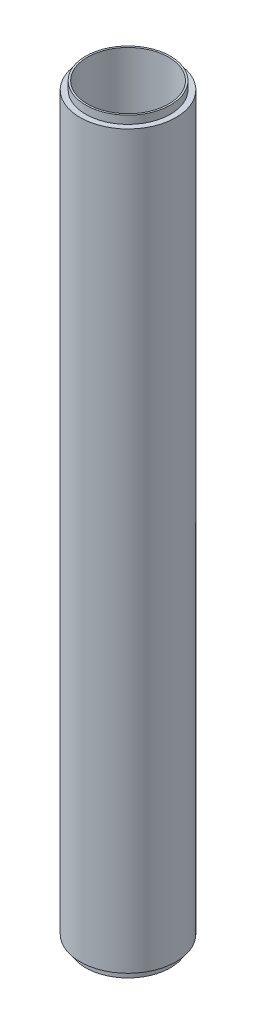
ISO-10303-21;
HEADER;
FILE_DESCRIPTION(('STEP AP214'),'2;1');
FILE_NAME('part.step','',(''),(''),'','','');
FILE_SCHEMA(('AUTOMOTIVE_DESIGN { 1 0 10303 214 1 1 1 1 }'));
ENDSEC;
DATA;
#1=APPLICATION_CONTEXT('core data for automotive mechanical design processes');
#2=APPLICATION_PROTOCOL_DEFINITION('international standard','automotive_design',2000,#1);
#3=PRODUCT_CONTEXT('',#1,'mechanical');
#4=PRODUCT('Part','Part','',(#3));
#5=PRODUCT_RELATED_PRODUCT_CATEGORY('part','',(#4));
#6=PRODUCT_DEFINITION_FORMATION('','',#4);
#7=PRODUCT_DEFINITION_CONTEXT('part definition',#1,'design');
#8=PRODUCT_DEFINITION('design','',#6,#7);
#9=PRODUCT_DEFINITION_SHAPE('','',#8);
#10=(LENGTH_UNIT() NAMED_UNIT(*) SI_UNIT(.MILLI.,.METRE.));
#11=(NAMED_UNIT(*) PLANE_ANGLE_UNIT() SI_UNIT($,.RADIAN.));
#12=(NAMED_UNIT(*) SI_UNIT($,.STERADIAN.) SOLID_ANGLE_UNIT());
#13=UNCERTAINTY_MEASURE_WITH_UNIT(LENGTH_MEASURE(1.E-05),#10,'distance_accuracy_value','');
#14=(GEOMETRIC_REPRESENTATION_CONTEXT(3) GLOBAL_UNCERTAINTY_ASSIGNED_CONTEXT((#13)) GLOBAL_UNIT_ASSIGNED_CONTEXT((#10,
#11,#12)) REPRESENTATION_CONTEXT('',''));
#15=CARTESIAN_POINT('',(0.,0.,0.));
#16=DIRECTION('',(0.,0.,1.));
#17=DIRECTION('',(1.,0.,0.));
#18=AXIS2_PLACEMENT_3D('',#15,#16,#17);
#19=CARTESIAN_POINT('',(26.5000000000001,-233.6,0.));
#20=DIRECTION('',(0.,-1.,0.));
#21=DIRECTION('',(0.,0.,-1.));
#22=AXIS2_PLACEMENT_3D('',#19,#20,#21);
#23=PLANE('',#22);
#24=CARTESIAN_POINT('',(0.,-233.6,0.));
#25=DIRECTION('',(0.,-1.,0.));
#26=DIRECTION('',(0.,0.,-1.));
#27=AXIS2_PLACEMENT_3D('',#24,#25,#26);
#28=CIRCLE('',#27,26.5000000000001);
#29=CARTESIAN_POINT('',(0.,-233.6,-26.5000000000001));
#30=VERTEX_POINT('',#29);
#31=EDGE_CURVE('E59',#30,#30,#28,.T.);
#32=ORIENTED_EDGE('',*,*,#31,.T.);
#33=EDGE_LOOP('',(#32));
#34=FACE_BOUND('',#33,.T.);
#35=CARTESIAN_POINT('',(0.,-233.6,0.));
#36=DIRECTION('',(0.,-1.,0.));
#37=DIRECTION('',(0.,0.,-1.));
#38=AXIS2_PLACEMENT_3D('',#35,#36,#37);
#39=CIRCLE('',#38,25.4);
#40=CARTESIAN_POINT('',(0.,-233.6,-25.4));
#41=VERTEX_POINT('',#40);
#42=EDGE_CURVE('E10',#41,#41,#39,.T.);
#43=ORIENTED_EDGE('',*,*,#42,.F.);
#44=EDGE_LOOP('',(#43));
#45=FACE_BOUND('',#44,.T.);
#46=ADVANCED_FACE('F31',(#34,#45),#23,.T.);
#47=CARTESIAN_POINT('',(0.,-24.2741539078646,0.));
#48=DIRECTION('',(0.,-1.,0.));
#49=DIRECTION('',(0.,0.,-1.));
#50=AXIS2_PLACEMENT_3D('',#47,#48,#49);
#51=CYLINDRICAL_SURFACE('',#50,25.4);
#52=ORIENTED_EDGE('',*,*,#42,.T.);
#53=EDGE_LOOP('',(#52));
#54=FACE_BOUND('',#53,.T.);
#55=CARTESIAN_POINT('',(0.,233.6,0.));
#56=DIRECTION('',(0.,-1.,0.));
#57=DIRECTION('',(0.,0.,-1.));
#58=AXIS2_PLACEMENT_3D('',#55,#56,#57);
#59=CIRCLE('',#58,25.4);
#60=CARTESIAN_POINT('',(0.,233.6,-25.4));
#61=VERTEX_POINT('',#60);
#62=EDGE_CURVE('E37',#61,#61,#59,.T.);
#63=ORIENTED_EDGE('',*,*,#62,.F.);
#64=EDGE_LOOP('',(#63));
#65=FACE_BOUND('',#64,.T.);
#66=ADVANCED_FACE('F77',(#54,#65),#51,.F.);
#67=CARTESIAN_POINT('',(25.4,233.6,0.));
#68=DIRECTION('',(0.,1.,0.));
#69=DIRECTION('',(0.,0.,1.));
#70=AXIS2_PLACEMENT_3D('',#67,#68,#69);
#71=PLANE('',#70);
#72=ORIENTED_EDGE('',*,*,#62,.T.);
#73=EDGE_LOOP('',(#72));
#74=FACE_BOUND('',#73,.T.);
#75=CARTESIAN_POINT('',(0.,233.6,0.));
#76=DIRECTION('',(0.,-1.,0.));
#77=DIRECTION('',(0.,0.,-1.));
#78=AXIS2_PLACEMENT_3D('',#75,#76,#77);
#79=CIRCLE('',#78,26.5000000000001);
#80=CARTESIAN_POINT('',(0.,233.6,-26.5000000000001));
#81=VERTEX_POINT('',#80);
#82=EDGE_CURVE('E41',#81,#81,#79,.T.);
#83=ORIENTED_EDGE('',*,*,#82,.F.);
#84=EDGE_LOOP('',(#83));
#85=FACE_BOUND('',#84,.T.);
#86=ADVANCED_FACE('F81',(#74,#85),#71,.T.);
#87=CARTESIAN_POINT('',(0.,-24.2741539078646,0.));
#88=DIRECTION('',(0.,-1.,0.));
#89=DIRECTION('',(0.,0.,-1.));
#90=AXIS2_PLACEMENT_3D('',#87,#88,#89);
#91=CYLINDRICAL_SURFACE('',#90,26.5000000000001);
#92=ORIENTED_EDGE('',*,*,#82,.T.);
#93=EDGE_LOOP('',(#92));
#94=FACE_BOUND('',#93,.T.);
#95=CARTESIAN_POINT('',(0.,228.6,0.));
#96=DIRECTION('',(0.,-1.,0.));
#97=DIRECTION('',(0.,0.,-1.));
#98=AXIS2_PLACEMENT_3D('',#95,#96,#97);
#99=CIRCLE('',#98,26.5000000000001);
#100=CARTESIAN_POINT('',(0.,228.6,-26.5000000000001));
#101=VERTEX_POINT('',#100);
#102=EDGE_CURVE('E45',#101,#101,#99,.T.);
#103=ORIENTED_EDGE('',*,*,#102,.F.);
#104=EDGE_LOOP('',(#103));
#105=FACE_BOUND('',#104,.T.);
#106=ADVANCED_FACE('F85',(#94,#105),#91,.T.);
#107=CARTESIAN_POINT('',(26.5000000000001,228.6,0.));
#108=DIRECTION('',(0.,1.,0.));
#109=DIRECTION('',(0.,0.,1.));
#110=AXIS2_PLACEMENT_3D('',#107,#108,#109);
#111=PLANE('',#110);
#112=ORIENTED_EDGE('',*,*,#102,.T.);
#113=EDGE_LOOP('',(#112));
#114=FACE_BOUND('',#113,.T.);
#115=CARTESIAN_POINT('',(0.,228.6,0.));
#116=DIRECTION('',(0.,-1.,0.));
#117=DIRECTION('',(0.,0.,-1.));
#118=AXIS2_PLACEMENT_3D('',#115,#116,#117);
#119=CIRCLE('',#118,30.);
#120=CARTESIAN_POINT('',(0.,228.6,-30.));
#121=VERTEX_POINT('',#120);
#122=EDGE_CURVE('E50',#121,#121,#119,.T.);
#123=ORIENTED_EDGE('',*,*,#122,.F.);
#124=EDGE_LOOP('',(#123));
#125=FACE_BOUND('',#124,.T.);
#126=ADVANCED_FACE('F91',(#114,#125),#111,.T.);
#127=CARTESIAN_POINT('',(0.,-24.2741539078646,0.));
#128=DIRECTION('',(0.,-1.,0.));
#129=DIRECTION('',(0.,0.,-1.));
#130=AXIS2_PLACEMENT_3D('',#127,#128,#129);
#131=CYLINDRICAL_SURFACE('',#130,30.);
#132=ORIENTED_EDGE('',*,*,#122,.T.);
#133=EDGE_LOOP('',(#132));
#134=FACE_BOUND('',#133,.T.);
#135=CARTESIAN_POINT('',(0.,-228.6,0.));
#136=DIRECTION('',(0.,-1.,0.));
#137=DIRECTION('',(0.,0.,-1.));
#138=AXIS2_PLACEMENT_3D('',#135,#136,#137);
#139=CIRCLE('',#138,30.);
#140=CARTESIAN_POINT('',(0.,-228.6,-30.));
#141=VERTEX_POINT('',#140);
#142=EDGE_CURVE('E53',#141,#141,#139,.T.);
#143=ORIENTED_EDGE('',*,*,#142,.F.);
#144=EDGE_LOOP('',(#143));
#145=FACE_BOUND('',#144,.T.);
#146=ADVANCED_FACE('F73',(#134,#145),#131,.T.);
#147=CARTESIAN_POINT('',(30.,-228.6,0.));
#148=DIRECTION('',(0.,-1.,0.));
#149=DIRECTION('',(0.,0.,-1.));
#150=AXIS2_PLACEMENT_3D('',#147,#148,#149);
#151=PLANE('',#150);
#152=ORIENTED_EDGE('',*,*,#142,.T.);
#153=EDGE_LOOP('',(#152));
#154=FACE_BOUND('',#153,.T.);
#155=CARTESIAN_POINT('',(0.,-228.6,0.));
#156=DIRECTION('',(0.,-1.,0.));
#157=DIRECTION('',(0.,0.,-1.));
#158=AXIS2_PLACEMENT_3D('',#155,#156,#157);
#159=CIRCLE('',#158,26.5000000000001);
#160=CARTESIAN_POINT('',(0.,-228.6,-26.5000000000001));
#161=VERTEX_POINT('',#160);
#162=EDGE_CURVE('E56',#161,#161,#159,.T.);
#163=ORIENTED_EDGE('',*,*,#162,.F.);
#164=EDGE_LOOP('',(#163));
#165=FACE_BOUND('',#164,.T.);
#166=ADVANCED_FACE('F67',(#154,#165),#151,.T.);
#167=CARTESIAN_POINT('',(0.,-24.2741539078646,0.));
#168=DIRECTION('',(0.,-1.,0.));
#169=DIRECTION('',(0.,0.,-1.));
#170=AXIS2_PLACEMENT_3D('',#167,#168,#169);
#171=CYLINDRICAL_SURFACE('',#170,26.5000000000001);
#172=ORIENTED_EDGE('',*,*,#162,.T.);
#173=EDGE_LOOP('',(#172));
#174=FACE_BOUND('',#173,.T.);
#175=ORIENTED_EDGE('',*,*,#31,.F.);
#176=EDGE_LOOP('',(#175));
#177=FACE_BOUND('',#176,.T.);
#178=ADVANCED_FACE('F65',(#174,#177),#171,.T.);
#179=CLOSED_SHELL('',(#46,#66,#86,#106,#126,#146,#166,#178));
#180=MANIFOLD_SOLID_BREP('B2',#179);
#181=ADVANCED_BREP_SHAPE_REPRESENTATION('',(#18,#180),#14);
#182=SHAPE_DEFINITION_REPRESENTATION(#9,#181);
ENDSEC;
END-ISO-10303-21;
